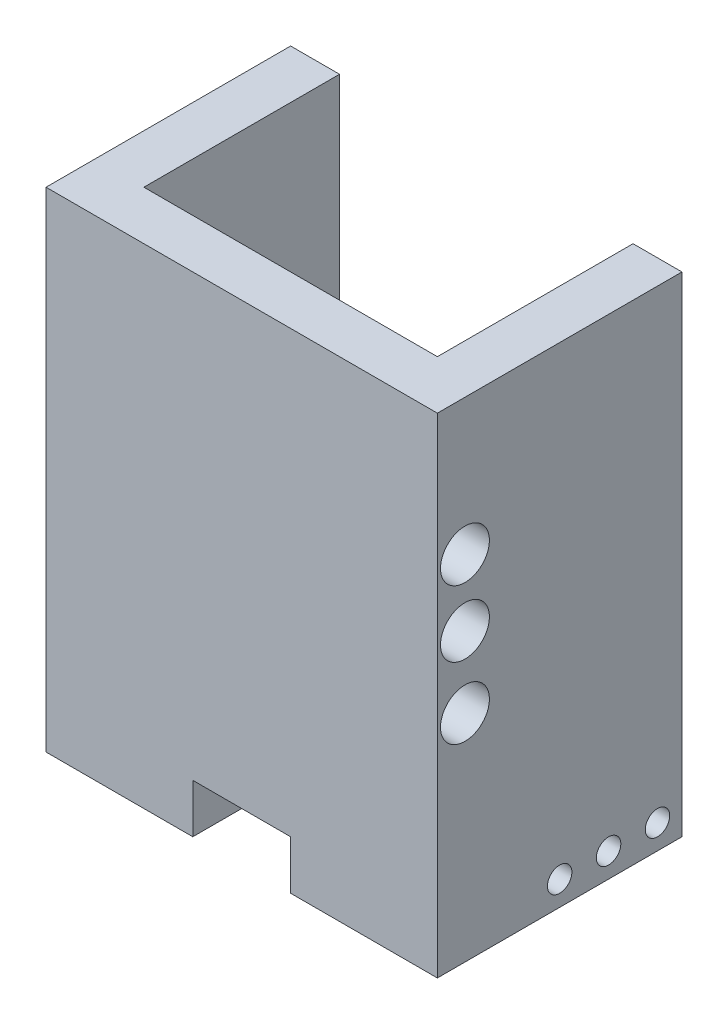
ISO-10303-21;
HEADER;
FILE_DESCRIPTION(('STEP AP214'),'2;1');
FILE_NAME('part.step','',(''),(''),'','','');
FILE_SCHEMA(('AUTOMOTIVE_DESIGN { 1 0 10303 214 1 1 1 1 }'));
ENDSEC;
DATA;
#1=APPLICATION_CONTEXT('core data for automotive mechanical design processes');
#2=APPLICATION_PROTOCOL_DEFINITION('international standard','automotive_design',2000,#1);
#3=PRODUCT_CONTEXT('',#1,'mechanical');
#4=PRODUCT('Part','Part','',(#3));
#5=PRODUCT_RELATED_PRODUCT_CATEGORY('part','',(#4));
#6=PRODUCT_DEFINITION_FORMATION('','',#4);
#7=PRODUCT_DEFINITION_CONTEXT('part definition',#1,'design');
#8=PRODUCT_DEFINITION('design','',#6,#7);
#9=PRODUCT_DEFINITION_SHAPE('','',#8);
#10=(LENGTH_UNIT() NAMED_UNIT(*) SI_UNIT(.MILLI.,.METRE.));
#11=(NAMED_UNIT(*) PLANE_ANGLE_UNIT() SI_UNIT($,.RADIAN.));
#12=(NAMED_UNIT(*) SI_UNIT($,.STERADIAN.) SOLID_ANGLE_UNIT());
#13=UNCERTAINTY_MEASURE_WITH_UNIT(LENGTH_MEASURE(1.E-05),#10,'distance_accuracy_value','');
#14=(GEOMETRIC_REPRESENTATION_CONTEXT(3) GLOBAL_UNCERTAINTY_ASSIGNED_CONTEXT((#13)) GLOBAL_UNIT_ASSIGNED_CONTEXT((#10,
#11,#12)) REPRESENTATION_CONTEXT('',''));
#15=CARTESIAN_POINT('',(0.,0.,0.));
#16=DIRECTION('',(0.,0.,1.));
#17=DIRECTION('',(1.,0.,0.));
#18=AXIS2_PLACEMENT_3D('',#15,#16,#17);
#19=CARTESIAN_POINT('',(-38.1,-127.,-12.7));
#20=DIRECTION('',(0.,0.,1.));
#21=DIRECTION('',(1.,0.,0.));
#22=AXIS2_PLACEMENT_3D('',#19,#20,#21);
#23=PLANE('',#22);
#24=DIRECTION('',(0.,1.,0.));
#25=VECTOR('',#24,1.);
#26=CARTESIAN_POINT('',(38.1,-127.,-12.7));
#27=LINE('',#26,#25);
#28=CARTESIAN_POINT('',(38.1,-67.9251795053301,-12.7));
#29=VERTEX_POINT('',#28);
#30=CARTESIAN_POINT('',(38.1,-55.6333245401822,-12.7));
#31=VERTEX_POINT('',#30);
#32=EDGE_CURVE('E163',#29,#31,#27,.T.);
#33=ORIENTED_EDGE('',*,*,#32,.F.);
#34=DIRECTION('',(-1.,0.,0.));
#35=VECTOR('',#34,1.);
#36=CARTESIAN_POINT('',(50.8,-67.9251795053301,-12.7));
#37=LINE('',#36,#35);
#38=CARTESIAN_POINT('',(-38.1,-67.9251795053301,-12.7));
#39=VERTEX_POINT('',#38);
#40=EDGE_CURVE('E158',#29,#39,#37,.T.);
#41=ORIENTED_EDGE('',*,*,#40,.T.);
#42=DIRECTION('',(0.,1.,0.));
#43=VECTOR('',#42,1.);
#44=CARTESIAN_POINT('',(-38.1,-127.,-12.7));
#45=LINE('',#44,#43);
#46=CARTESIAN_POINT('',(-38.1,-55.6333245401822,-12.7));
#47=VERTEX_POINT('',#46);
#48=EDGE_CURVE('E56',#39,#47,#45,.T.);
#49=ORIENTED_EDGE('',*,*,#48,.T.);
#50=DIRECTION('',(-1.,0.,0.));
#51=VECTOR('',#50,1.);
#52=CARTESIAN_POINT('',(50.8,-55.6333245401822,-12.7));
#53=LINE('',#52,#51);
#54=EDGE_CURVE('E289',#47,#31,#53,.F.);
#55=ORIENTED_EDGE('',*,*,#54,.T.);
#56=EDGE_LOOP('',(#33,#41,#49,#55));
#57=FACE_BOUND('',#56,.T.);
#58=ADVANCED_FACE('F32',(#57),#23,.F.);
#59=CARTESIAN_POINT('',(38.1,-49.4271387499624,-12.7));
#60=VERTEX_POINT('',#59);
#61=CARTESIAN_POINT('',(38.1,-38.4258447677471,-12.7));
#62=VERTEX_POINT('',#61);
#63=EDGE_CURVE('E337',#60,#62,#27,.T.);
#64=ORIENTED_EDGE('',*,*,#63,.F.);
#65=DIRECTION('',(-1.,0.,0.));
#66=VECTOR('',#65,1.);
#67=CARTESIAN_POINT('',(50.8,-49.4271387499624,-12.7));
#68=LINE('',#67,#66);
#69=CARTESIAN_POINT('',(-38.1,-49.4271387499624,-12.7));
#70=VERTEX_POINT('',#69);
#71=EDGE_CURVE('E293',#60,#70,#68,.T.);
#72=ORIENTED_EDGE('',*,*,#71,.T.);
#73=CARTESIAN_POINT('',(-38.1,-38.4258447677471,-12.7));
#74=VERTEX_POINT('',#73);
#75=EDGE_CURVE('E170',#70,#74,#45,.T.);
#76=ORIENTED_EDGE('',*,*,#75,.T.);
#77=DIRECTION('',(-1.,0.,0.));
#78=VECTOR('',#77,1.);
#79=CARTESIAN_POINT('',(50.8,-38.4258447677471,-12.7));
#80=LINE('',#79,#78);
#81=EDGE_CURVE('E303',#74,#62,#80,.F.);
#82=ORIENTED_EDGE('',*,*,#81,.T.);
#83=EDGE_LOOP('',(#64,#72,#76,#82));
#84=FACE_BOUND('',#83,.T.);
#85=ADVANCED_FACE('F347',(#84),#23,.F.);
#86=CARTESIAN_POINT('',(38.1,-32.2196589775273,-12.7));
#87=VERTEX_POINT('',#86);
#88=CARTESIAN_POINT('',(38.1,0.,-12.7));
#89=VERTEX_POINT('',#88);
#90=EDGE_CURVE('E172',#87,#89,#27,.T.);
#91=ORIENTED_EDGE('',*,*,#90,.F.);
#92=DIRECTION('',(-1.,0.,0.));
#93=VECTOR('',#92,1.);
#94=CARTESIAN_POINT('',(50.8,-32.2196589775273,-12.7));
#95=LINE('',#94,#93);
#96=CARTESIAN_POINT('',(-38.1,-32.2196589775273,-12.7));
#97=VERTEX_POINT('',#96);
#98=EDGE_CURVE('E308',#87,#97,#95,.T.);
#99=ORIENTED_EDGE('',*,*,#98,.T.);
#100=CARTESIAN_POINT('',(-38.1,0.,-12.7));
#101=VERTEX_POINT('',#100);
#102=EDGE_CURVE('E173',#97,#101,#45,.T.);
#103=ORIENTED_EDGE('',*,*,#102,.T.);
#104=DIRECTION('',(1.,0.,0.));
#105=VECTOR('',#104,1.);
#106=CARTESIAN_POINT('',(-38.1,0.,-12.7));
#107=LINE('',#106,#105);
#108=EDGE_CURVE('E327',#101,#89,#107,.T.);
#109=ORIENTED_EDGE('',*,*,#108,.T.);
#110=EDGE_LOOP('',(#91,#99,#103,#109));
#111=FACE_BOUND('',#110,.T.);
#112=ADVANCED_FACE('F350',(#111),#23,.F.);
#113=CARTESIAN_POINT('',(0.,0.,-63.5));
#114=DIRECTION('',(0.,0.,-1.));
#115=DIRECTION('',(-1.,0.,0.));
#116=AXIS2_PLACEMENT_3D('',#113,#114,#115);
#117=PLANE('',#116);
#118=DIRECTION('',(0.,1.,0.));
#119=VECTOR('',#118,1.);
#120=CARTESIAN_POINT('',(38.1,-127.,-63.5));
#121=LINE('',#120,#119);
#122=CARTESIAN_POINT('',(38.1,-127.,-63.5));
#123=VERTEX_POINT('',#122);
#124=CARTESIAN_POINT('',(38.1,0.,-63.5));
#125=VERTEX_POINT('',#124);
#126=EDGE_CURVE('E184',#123,#125,#121,.T.);
#127=ORIENTED_EDGE('',*,*,#126,.T.);
#128=DIRECTION('',(-1.,0.,0.));
#129=VECTOR('',#128,1.);
#130=CARTESIAN_POINT('',(-50.8,0.,-63.5));
#131=LINE('',#130,#129);
#132=CARTESIAN_POINT('',(50.8,0.,-63.5));
#133=VERTEX_POINT('',#132);
#134=EDGE_CURVE('E202',#133,#125,#131,.T.);
#135=ORIENTED_EDGE('',*,*,#134,.F.);
#136=DIRECTION('',(0.,1.,0.));
#137=VECTOR('',#136,1.);
#138=CARTESIAN_POINT('',(50.8,-127.,-63.5));
#139=LINE('',#138,#137);
#140=CARTESIAN_POINT('',(50.8,-127.,-63.5));
#141=VERTEX_POINT('',#140);
#142=EDGE_CURVE('E198',#141,#133,#139,.T.);
#143=ORIENTED_EDGE('',*,*,#142,.F.);
#144=DIRECTION('',(1.,0.,0.));
#145=VECTOR('',#144,1.);
#146=CARTESIAN_POINT('',(12.7,-127.,-63.5));
#147=LINE('',#146,#145);
#148=EDGE_CURVE('E196',#123,#141,#147,.T.);
#149=ORIENTED_EDGE('',*,*,#148,.F.);
#150=EDGE_LOOP('',(#127,#135,#143,#149));
#151=FACE_BOUND('',#150,.T.);
#152=ADVANCED_FACE('F362',(#151),#117,.T.);
#153=CARTESIAN_POINT('',(-50.8,-127.,-63.5));
#154=DIRECTION('',(-1.,0.,0.));
#155=DIRECTION('',(0.,0.,1.));
#156=AXIS2_PLACEMENT_3D('',#153,#154,#155);
#157=PLANE('',#156);
#158=CARTESIAN_POINT('',(-50.8,-120.65,-31.75));
#159=DIRECTION('',(-1.,0.,0.));
#160=DIRECTION('',(0.,0.,1.));
#161=AXIS2_PLACEMENT_3D('',#158,#159,#160);
#162=CIRCLE('',#161,3.175);
#163=CARTESIAN_POINT('',(-50.8,-120.65,-28.575));
#164=VERTEX_POINT('',#163);
#165=EDGE_CURVE('E623',#164,#164,#162,.T.);
#166=ORIENTED_EDGE('',*,*,#165,.F.);
#167=EDGE_LOOP('',(#166));
#168=FACE_BOUND('',#167,.T.);
#169=CARTESIAN_POINT('',(-50.8,-120.65,-44.45));
#170=DIRECTION('',(-1.,0.,0.));
#171=DIRECTION('',(0.,0.,1.));
#172=AXIS2_PLACEMENT_3D('',#169,#170,#171);
#173=CIRCLE('',#172,3.175);
#174=CARTESIAN_POINT('',(-50.8,-120.65,-41.275));
#175=VERTEX_POINT('',#174);
#176=EDGE_CURVE('E261',#175,#175,#173,.T.);
#177=ORIENTED_EDGE('',*,*,#176,.F.);
#178=EDGE_LOOP('',(#177));
#179=FACE_BOUND('',#178,.T.);
#180=CARTESIAN_POINT('',(-50.8,-120.65,-57.15));
#181=DIRECTION('',(-1.,0.,0.));
#182=DIRECTION('',(0.,0.,1.));
#183=AXIS2_PLACEMENT_3D('',#180,#181,#182);
#184=CIRCLE('',#183,3.175);
#185=CARTESIAN_POINT('',(-50.8,-120.65,-53.975));
#186=VERTEX_POINT('',#185);
#187=EDGE_CURVE('E258',#186,#186,#184,.T.);
#188=ORIENTED_EDGE('',*,*,#187,.F.);
#189=EDGE_LOOP('',(#188));
#190=FACE_BOUND('',#189,.T.);
#191=CARTESIAN_POINT('',(-50.8,-71.02827240044,-7.15984526530906));
#192=DIRECTION('',(-1.,0.,0.));
#193=DIRECTION('',(0.,0.,1.));
#194=AXIS2_PLACEMENT_3D('',#191,#192,#193);
#195=CIRCLE('',#194,6.35);
#196=CARTESIAN_POINT('',(-50.8,-71.02827240044,-0.809845265309065));
#197=VERTEX_POINT('',#196);
#198=EDGE_CURVE('E277',#197,#197,#195,.T.);
#199=ORIENTED_EDGE('',*,*,#198,.F.);
#200=EDGE_LOOP('',(#199));
#201=FACE_BOUND('',#200,.T.);
#202=CARTESIAN_POINT('',(-50.8,-52.5302316450723,-7.15984526530906));
#203=DIRECTION('',(-1.,0.,0.));
#204=DIRECTION('',(0.,0.,1.));
#205=AXIS2_PLACEMENT_3D('',#202,#203,#204);
#206=CIRCLE('',#205,6.35);
#207=CARTESIAN_POINT('',(-50.8,-52.5302316450723,-0.809845265309062));
#208=VERTEX_POINT('',#207);
#209=EDGE_CURVE('E285',#208,#208,#206,.T.);
#210=ORIENTED_EDGE('',*,*,#209,.F.);
#211=EDGE_LOOP('',(#210));
#212=FACE_BOUND('',#211,.T.);
#213=CARTESIAN_POINT('',(-50.8,-35.3227518726372,-7.15984526530906));
#214=DIRECTION('',(-1.,0.,0.));
#215=DIRECTION('',(0.,0.,1.));
#216=AXIS2_PLACEMENT_3D('',#213,#214,#215);
#217=CIRCLE('',#216,6.35);
#218=CARTESIAN_POINT('',(-50.8,-35.3227518726372,-0.809845265309062));
#219=VERTEX_POINT('',#218);
#220=EDGE_CURVE('E299',#219,#219,#217,.T.);
#221=ORIENTED_EDGE('',*,*,#220,.F.);
#222=EDGE_LOOP('',(#221));
#223=FACE_BOUND('',#222,.T.);
#224=DIRECTION('',(0.,-1.,0.));
#225=VECTOR('',#224,1.);
#226=CARTESIAN_POINT('',(-50.8,-127.,0.));
#227=LINE('',#226,#225);
#228=CARTESIAN_POINT('',(-50.8,0.,0.));
#229=VERTEX_POINT('',#228);
#230=CARTESIAN_POINT('',(-50.8,-127.,0.));
#231=VERTEX_POINT('',#230);
#232=EDGE_CURVE('E188',#229,#231,#227,.T.);
#233=ORIENTED_EDGE('',*,*,#232,.F.);
#234=DIRECTION('',(0.,0.,1.));
#235=VECTOR('',#234,1.);
#236=CARTESIAN_POINT('',(-50.8,0.,-63.5));
#237=LINE('',#236,#235);
#238=CARTESIAN_POINT('',(-50.8,0.,-63.5));
#239=VERTEX_POINT('',#238);
#240=EDGE_CURVE('E228',#239,#229,#237,.T.);
#241=ORIENTED_EDGE('',*,*,#240,.F.);
#242=DIRECTION('',(0.,-1.,0.));
#243=VECTOR('',#242,1.);
#244=CARTESIAN_POINT('',(-50.8,-127.,-63.5));
#245=LINE('',#244,#243);
#246=CARTESIAN_POINT('',(-50.8,-127.,-63.5));
#247=VERTEX_POINT('',#246);
#248=EDGE_CURVE('E189',#239,#247,#245,.T.);
#249=ORIENTED_EDGE('',*,*,#248,.T.);
#250=DIRECTION('',(0.,0.,1.));
#251=VECTOR('',#250,1.);
#252=CARTESIAN_POINT('',(-50.8,-127.,-63.5));
#253=LINE('',#252,#251);
#254=EDGE_CURVE('E205',#247,#231,#253,.T.);
#255=ORIENTED_EDGE('',*,*,#254,.T.);
#256=EDGE_LOOP('',(#233,#241,#249,#255));
#257=FACE_BOUND('',#256,.T.);
#258=ADVANCED_FACE('F34',(#168,#179,#190,#201,#212,#223,#257),#157,.T.);
#259=CARTESIAN_POINT('',(-50.8,0.,-63.5));
#260=DIRECTION('',(0.,1.,0.));
#261=DIRECTION('',(0.,0.,1.));
#262=AXIS2_PLACEMENT_3D('',#259,#260,#261);
#263=PLANE('',#262);
#264=DIRECTION('',(0.,0.,-1.));
#265=VECTOR('',#264,1.);
#266=CARTESIAN_POINT('',(38.1,0.,-63.5));
#267=LINE('',#266,#265);
#268=EDGE_CURVE('E319',#89,#125,#267,.T.);
#269=ORIENTED_EDGE('',*,*,#268,.F.);
#270=ORIENTED_EDGE('',*,*,#108,.F.);
#271=DIRECTION('',(0.,0.,1.));
#272=VECTOR('',#271,1.);
#273=CARTESIAN_POINT('',(-38.1,0.,-50.8));
#274=LINE('',#273,#272);
#275=CARTESIAN_POINT('',(-38.1,0.,-63.5));
#276=VERTEX_POINT('',#275);
#277=EDGE_CURVE('E314',#276,#101,#274,.T.);
#278=ORIENTED_EDGE('',*,*,#277,.F.);
#279=EDGE_CURVE('E201',#276,#239,#131,.T.);
#280=ORIENTED_EDGE('',*,*,#279,.T.);
#281=ORIENTED_EDGE('',*,*,#240,.T.);
#282=DIRECTION('',(-1.,0.,0.));
#283=VECTOR('',#282,1.);
#284=CARTESIAN_POINT('',(-50.8,0.,0.));
#285=LINE('',#284,#283);
#286=CARTESIAN_POINT('',(50.8,0.,0.));
#287=VERTEX_POINT('',#286);
#288=EDGE_CURVE('E193',#287,#229,#285,.T.);
#289=ORIENTED_EDGE('',*,*,#288,.F.);
#290=DIRECTION('',(0.,0.,1.));
#291=VECTOR('',#290,1.);
#292=CARTESIAN_POINT('',(50.8,0.,-63.5));
#293=LINE('',#292,#291);
#294=EDGE_CURVE('E231',#133,#287,#293,.T.);
#295=ORIENTED_EDGE('',*,*,#294,.F.);
#296=ORIENTED_EDGE('',*,*,#134,.T.);
#297=EDGE_LOOP('',(#269,#270,#278,#280,#281,#289,#295,#296));
#298=FACE_BOUND('',#297,.T.);
#299=ADVANCED_FACE('F355',(#298),#263,.T.);
#300=CARTESIAN_POINT('',(50.8,-127.,-63.5));
#301=DIRECTION('',(1.,0.,0.));
#302=DIRECTION('',(0.,0.,-1.));
#303=AXIS2_PLACEMENT_3D('',#300,#301,#302);
#304=PLANE('',#303);
#305=CARTESIAN_POINT('',(50.8,-120.65,-31.75));
#306=DIRECTION('',(-1.,0.,0.));
#307=DIRECTION('',(0.,0.,1.));
#308=AXIS2_PLACEMENT_3D('',#305,#306,#307);
#309=CIRCLE('',#308,3.175);
#310=CARTESIAN_POINT('',(50.8,-120.65,-28.575));
#311=VERTEX_POINT('',#310);
#312=EDGE_CURVE('E606',#311,#311,#309,.T.);
#313=ORIENTED_EDGE('',*,*,#312,.T.);
#314=EDGE_LOOP('',(#313));
#315=FACE_BOUND('',#314,.T.);
#316=CARTESIAN_POINT('',(50.8,-120.65,-44.45));
#317=DIRECTION('',(-1.,0.,0.));
#318=DIRECTION('',(0.,0.,1.));
#319=AXIS2_PLACEMENT_3D('',#316,#317,#318);
#320=CIRCLE('',#319,3.175);
#321=CARTESIAN_POINT('',(50.8,-120.65,-41.275));
#322=VERTEX_POINT('',#321);
#323=EDGE_CURVE('E254',#322,#322,#320,.T.);
#324=ORIENTED_EDGE('',*,*,#323,.T.);
#325=EDGE_LOOP('',(#324));
#326=FACE_BOUND('',#325,.T.);
#327=CARTESIAN_POINT('',(50.8,-120.65,-57.15));
#328=DIRECTION('',(-1.,0.,0.));
#329=DIRECTION('',(0.,0.,1.));
#330=AXIS2_PLACEMENT_3D('',#327,#328,#329);
#331=CIRCLE('',#330,3.175);
#332=CARTESIAN_POINT('',(50.8,-120.65,-53.975));
#333=VERTEX_POINT('',#332);
#334=EDGE_CURVE('E250',#333,#333,#331,.T.);
#335=ORIENTED_EDGE('',*,*,#334,.T.);
#336=EDGE_LOOP('',(#335));
#337=FACE_BOUND('',#336,.T.);
#338=CARTESIAN_POINT('',(50.8,-71.02827240044,-7.15984526530906));
#339=DIRECTION('',(-1.,0.,0.));
#340=DIRECTION('',(0.,0.,1.));
#341=AXIS2_PLACEMENT_3D('',#338,#339,#340);
#342=CIRCLE('',#341,6.35);
#343=CARTESIAN_POINT('',(50.8,-71.02827240044,-0.809845265309065));
#344=VERTEX_POINT('',#343);
#345=EDGE_CURVE('E278',#344,#344,#342,.T.);
#346=ORIENTED_EDGE('',*,*,#345,.T.);
#347=EDGE_LOOP('',(#346));
#348=FACE_BOUND('',#347,.T.);
#349=CARTESIAN_POINT('',(50.8,-52.5302316450723,-7.15984526530906));
#350=DIRECTION('',(-1.,0.,0.));
#351=DIRECTION('',(0.,0.,1.));
#352=AXIS2_PLACEMENT_3D('',#349,#350,#351);
#353=CIRCLE('',#352,6.35);
#354=CARTESIAN_POINT('',(50.8,-52.5302316450723,-0.809845265309062));
#355=VERTEX_POINT('',#354);
#356=EDGE_CURVE('E286',#355,#355,#353,.T.);
#357=ORIENTED_EDGE('',*,*,#356,.T.);
#358=EDGE_LOOP('',(#357));
#359=FACE_BOUND('',#358,.T.);
#360=CARTESIAN_POINT('',(50.8,-35.3227518726372,-7.15984526530906));
#361=DIRECTION('',(-1.,0.,0.));
#362=DIRECTION('',(0.,0.,1.));
#363=AXIS2_PLACEMENT_3D('',#360,#361,#362);
#364=CIRCLE('',#363,6.35);
#365=CARTESIAN_POINT('',(50.8,-35.3227518726372,-0.809845265309062));
#366=VERTEX_POINT('',#365);
#367=EDGE_CURVE('E300',#366,#366,#364,.T.);
#368=ORIENTED_EDGE('',*,*,#367,.T.);
#369=EDGE_LOOP('',(#368));
#370=FACE_BOUND('',#369,.T.);
#371=DIRECTION('',(0.,1.,0.));
#372=VECTOR('',#371,1.);
#373=CARTESIAN_POINT('',(50.8,-127.,0.));
#374=LINE('',#373,#372);
#375=CARTESIAN_POINT('',(50.8,-127.,0.));
#376=VERTEX_POINT('',#375);
#377=EDGE_CURVE('E223',#376,#287,#374,.T.);
#378=ORIENTED_EDGE('',*,*,#377,.F.);
#379=DIRECTION('',(0.,0.,1.));
#380=VECTOR('',#379,1.);
#381=CARTESIAN_POINT('',(50.8,-127.,-63.5));
#382=LINE('',#381,#380);
#383=EDGE_CURVE('E233',#141,#376,#382,.T.);
#384=ORIENTED_EDGE('',*,*,#383,.F.);
#385=ORIENTED_EDGE('',*,*,#142,.T.);
#386=ORIENTED_EDGE('',*,*,#294,.T.);
#387=EDGE_LOOP('',(#378,#384,#385,#386));
#388=FACE_BOUND('',#387,.T.);
#389=ADVANCED_FACE('F365',(#315,#326,#337,#348,#359,#370,#388),#304,.T.);
#390=CARTESIAN_POINT('',(12.7,-127.,-63.5));
#391=DIRECTION('',(0.,-1.,0.));
#392=DIRECTION('',(0.,0.,-1.));
#393=AXIS2_PLACEMENT_3D('',#390,#391,#392);
#394=PLANE('',#393);
#395=DIRECTION('',(0.,0.,-1.));
#396=VECTOR('',#395,1.);
#397=CARTESIAN_POINT('',(38.1,-127.,-12.7));
#398=LINE('',#397,#396);
#399=CARTESIAN_POINT('',(38.1,-127.,-12.7));
#400=VERTEX_POINT('',#399);
#401=EDGE_CURVE('E180',#400,#123,#398,.T.);
#402=ORIENTED_EDGE('',*,*,#401,.T.);
#403=ORIENTED_EDGE('',*,*,#148,.T.);
#404=ORIENTED_EDGE('',*,*,#383,.T.);
#405=DIRECTION('',(1.,0.,0.));
#406=VECTOR('',#405,1.);
#407=CARTESIAN_POINT('',(12.7,-127.,0.));
#408=LINE('',#407,#406);
#409=CARTESIAN_POINT('',(12.7,-127.,0.));
#410=VERTEX_POINT('',#409);
#411=EDGE_CURVE('E220',#410,#376,#408,.T.);
#412=ORIENTED_EDGE('',*,*,#411,.F.);
#413=DIRECTION('',(0.,0.,1.));
#414=VECTOR('',#413,1.);
#415=CARTESIAN_POINT('',(12.7,-127.,-63.5));
#416=LINE('',#415,#414);
#417=CARTESIAN_POINT('',(12.7,-127.,-12.7));
#418=VERTEX_POINT('',#417);
#419=EDGE_CURVE('E235',#418,#410,#416,.T.);
#420=ORIENTED_EDGE('',*,*,#419,.F.);
#421=DIRECTION('',(1.,0.,0.));
#422=VECTOR('',#421,1.);
#423=CARTESIAN_POINT('',(-38.1,-127.,-12.7));
#424=LINE('',#423,#422);
#425=EDGE_CURVE('E318',#418,#400,#424,.T.);
#426=ORIENTED_EDGE('',*,*,#425,.T.);
#427=EDGE_LOOP('',(#402,#403,#404,#412,#420,#426));
#428=FACE_BOUND('',#427,.T.);
#429=ADVANCED_FACE('F358',(#428),#394,.T.);
#430=CARTESIAN_POINT('',(12.7,-127.,-63.5));
#431=DIRECTION('',(-1.,0.,0.));
#432=DIRECTION('',(0.,0.,1.));
#433=AXIS2_PLACEMENT_3D('',#430,#431,#432);
#434=PLANE('',#433);
#435=DIRECTION('',(0.,1.,0.));
#436=VECTOR('',#435,1.);
#437=CARTESIAN_POINT('',(12.7,-127.,-12.7));
#438=LINE('',#437,#436);
#439=CARTESIAN_POINT('',(12.7,-114.3,-12.7));
#440=VERTEX_POINT('',#439);
#441=EDGE_CURVE('E186',#418,#440,#438,.T.);
#442=ORIENTED_EDGE('',*,*,#441,.F.);
#443=ORIENTED_EDGE('',*,*,#419,.T.);
#444=DIRECTION('',(0.,-1.,0.));
#445=VECTOR('',#444,1.);
#446=CARTESIAN_POINT('',(12.7,-127.,0.));
#447=LINE('',#446,#445);
#448=CARTESIAN_POINT('',(12.7,-114.3,0.));
#449=VERTEX_POINT('',#448);
#450=EDGE_CURVE('E217',#449,#410,#447,.T.);
#451=ORIENTED_EDGE('',*,*,#450,.F.);
#452=DIRECTION('',(0.,0.,1.));
#453=VECTOR('',#452,1.);
#454=CARTESIAN_POINT('',(12.7,-114.3,-63.5));
#455=LINE('',#454,#453);
#456=EDGE_CURVE('E237',#440,#449,#455,.T.);
#457=ORIENTED_EDGE('',*,*,#456,.F.);
#458=EDGE_LOOP('',(#442,#443,#451,#457));
#459=FACE_BOUND('',#458,.T.);
#460=ADVANCED_FACE('F374',(#459),#434,.T.);
#461=CARTESIAN_POINT('',(-12.7,-114.3,-63.5));
#462=DIRECTION('',(0.,-1.,0.));
#463=DIRECTION('',(0.,0.,-1.));
#464=AXIS2_PLACEMENT_3D('',#461,#462,#463);
#465=PLANE('',#464);
#466=DIRECTION('',(-1.,0.,0.));
#467=VECTOR('',#466,1.);
#468=CARTESIAN_POINT('',(-12.7,-114.3,-12.7));
#469=LINE('',#468,#467);
#470=CARTESIAN_POINT('',(-12.7,-114.3,-12.7));
#471=VERTEX_POINT('',#470);
#472=EDGE_CURVE('E183',#440,#471,#469,.T.);
#473=ORIENTED_EDGE('',*,*,#472,.F.);
#474=ORIENTED_EDGE('',*,*,#456,.T.);
#475=DIRECTION('',(1.,0.,0.));
#476=VECTOR('',#475,1.);
#477=CARTESIAN_POINT('',(-12.7,-114.3,0.));
#478=LINE('',#477,#476);
#479=CARTESIAN_POINT('',(-12.7,-114.3,0.));
#480=VERTEX_POINT('',#479);
#481=EDGE_CURVE('E214',#480,#449,#478,.T.);
#482=ORIENTED_EDGE('',*,*,#481,.F.);
#483=DIRECTION('',(0.,0.,1.));
#484=VECTOR('',#483,1.);
#485=CARTESIAN_POINT('',(-12.7,-114.3,-63.5));
#486=LINE('',#485,#484);
#487=EDGE_CURVE('E239',#471,#480,#486,.T.);
#488=ORIENTED_EDGE('',*,*,#487,.F.);
#489=EDGE_LOOP('',(#473,#474,#482,#488));
#490=FACE_BOUND('',#489,.T.);
#491=ADVANCED_FACE('F381',(#490),#465,.T.);
#492=CARTESIAN_POINT('',(-12.7,-127.,-63.5));
#493=DIRECTION('',(1.,0.,0.));
#494=DIRECTION('',(0.,0.,-1.));
#495=AXIS2_PLACEMENT_3D('',#492,#493,#494);
#496=PLANE('',#495);
#497=DIRECTION('',(0.,-1.,0.));
#498=VECTOR('',#497,1.);
#499=CARTESIAN_POINT('',(-12.7,-127.,-12.7));
#500=LINE('',#499,#498);
#501=CARTESIAN_POINT('',(-12.7,-127.,-12.7));
#502=VERTEX_POINT('',#501);
#503=EDGE_CURVE('E181',#471,#502,#500,.T.);
#504=ORIENTED_EDGE('',*,*,#503,.F.);
#505=ORIENTED_EDGE('',*,*,#487,.T.);
#506=DIRECTION('',(0.,1.,0.));
#507=VECTOR('',#506,1.);
#508=CARTESIAN_POINT('',(-12.7,-127.,0.));
#509=LINE('',#508,#507);
#510=CARTESIAN_POINT('',(-12.7,-127.,0.));
#511=VERTEX_POINT('',#510);
#512=EDGE_CURVE('E211',#511,#480,#509,.T.);
#513=ORIENTED_EDGE('',*,*,#512,.F.);
#514=DIRECTION('',(0.,0.,1.));
#515=VECTOR('',#514,1.);
#516=CARTESIAN_POINT('',(-12.7,-127.,-63.5));
#517=LINE('',#516,#515);
#518=EDGE_CURVE('E241',#502,#511,#517,.T.);
#519=ORIENTED_EDGE('',*,*,#518,.F.);
#520=EDGE_LOOP('',(#504,#505,#513,#519));
#521=FACE_BOUND('',#520,.T.);
#522=ADVANCED_FACE('F384',(#521),#496,.T.);
#523=CARTESIAN_POINT('',(-50.8,-127.,-63.5));
#524=DIRECTION('',(0.,-1.,0.));
#525=DIRECTION('',(0.,0.,-1.));
#526=AXIS2_PLACEMENT_3D('',#523,#524,#525);
#527=PLANE('',#526);
#528=CARTESIAN_POINT('',(-38.1,-127.,-12.7));
#529=VERTEX_POINT('',#528);
#530=EDGE_CURVE('E320',#529,#502,#424,.T.);
#531=ORIENTED_EDGE('',*,*,#530,.T.);
#532=ORIENTED_EDGE('',*,*,#518,.T.);
#533=DIRECTION('',(1.,0.,0.));
#534=VECTOR('',#533,1.);
#535=CARTESIAN_POINT('',(-50.8,-127.,0.));
#536=LINE('',#535,#534);
#537=EDGE_CURVE('E208',#231,#511,#536,.T.);
#538=ORIENTED_EDGE('',*,*,#537,.F.);
#539=ORIENTED_EDGE('',*,*,#254,.F.);
#540=DIRECTION('',(1.,0.,0.));
#541=VECTOR('',#540,1.);
#542=CARTESIAN_POINT('',(-50.8,-127.,-63.5));
#543=LINE('',#542,#541);
#544=CARTESIAN_POINT('',(-38.1,-127.,-63.5));
#545=VERTEX_POINT('',#544);
#546=EDGE_CURVE('E192',#247,#545,#543,.T.);
#547=ORIENTED_EDGE('',*,*,#546,.T.);
#548=DIRECTION('',(0.,0.,1.));
#549=VECTOR('',#548,1.);
#550=CARTESIAN_POINT('',(-38.1,-127.,-50.8));
#551=LINE('',#550,#549);
#552=EDGE_CURVE('E315',#545,#529,#551,.T.);
#553=ORIENTED_EDGE('',*,*,#552,.T.);
#554=EDGE_LOOP('',(#531,#532,#538,#539,#547,#553));
#555=FACE_BOUND('',#554,.T.);
#556=ADVANCED_FACE('F388',(#555),#527,.T.);
#557=DIRECTION('',(0.,1.,0.));
#558=VECTOR('',#557,1.);
#559=CARTESIAN_POINT('',(-38.1,-127.,-63.5));
#560=LINE('',#559,#558);
#561=EDGE_CURVE('E178',#545,#276,#560,.T.);
#562=ORIENTED_EDGE('',*,*,#561,.F.);
#563=ORIENTED_EDGE('',*,*,#546,.F.);
#564=ORIENTED_EDGE('',*,*,#248,.F.);
#565=ORIENTED_EDGE('',*,*,#279,.F.);
#566=EDGE_LOOP('',(#562,#563,#564,#565));
#567=FACE_BOUND('',#566,.T.);
#568=ADVANCED_FACE('F394',(#567),#117,.T.);
#569=CARTESIAN_POINT('',(0.,0.,0.));
#570=DIRECTION('',(0.,0.,-1.));
#571=DIRECTION('',(-1.,0.,0.));
#572=AXIS2_PLACEMENT_3D('',#569,#570,#571);
#573=PLANE('',#572);
#574=ORIENTED_EDGE('',*,*,#232,.T.);
#575=ORIENTED_EDGE('',*,*,#537,.T.);
#576=ORIENTED_EDGE('',*,*,#512,.T.);
#577=ORIENTED_EDGE('',*,*,#481,.T.);
#578=ORIENTED_EDGE('',*,*,#450,.T.);
#579=ORIENTED_EDGE('',*,*,#411,.T.);
#580=ORIENTED_EDGE('',*,*,#377,.T.);
#581=ORIENTED_EDGE('',*,*,#288,.T.);
#582=EDGE_LOOP('',(#574,#575,#576,#577,#578,#579,#580,#581));
#583=FACE_BOUND('',#582,.T.);
#584=ADVANCED_FACE('F369',(#583),#573,.F.);
#585=CARTESIAN_POINT('',(38.1,-127.,-63.5));
#586=DIRECTION('',(1.,0.,0.));
#587=DIRECTION('',(0.,0.,-1.));
#588=AXIS2_PLACEMENT_3D('',#585,#586,#587);
#589=PLANE('',#588);
#590=CARTESIAN_POINT('',(38.1,-120.65,-31.75));
#591=DIRECTION('',(1.,0.,0.));
#592=DIRECTION('',(0.,0.,-1.));
#593=AXIS2_PLACEMENT_3D('',#590,#591,#592);
#594=CIRCLE('',#593,3.175);
#595=CARTESIAN_POINT('',(38.1,-120.65,-34.925));
#596=VERTEX_POINT('',#595);
#597=EDGE_CURVE('E266',#596,#596,#594,.T.);
#598=ORIENTED_EDGE('',*,*,#597,.T.);
#599=EDGE_LOOP('',(#598));
#600=FACE_BOUND('',#599,.T.);
#601=CARTESIAN_POINT('',(38.1,-120.65,-44.45));
#602=DIRECTION('',(1.,0.,0.));
#603=DIRECTION('',(0.,0.,-1.));
#604=AXIS2_PLACEMENT_3D('',#601,#602,#603);
#605=CIRCLE('',#604,3.175);
#606=CARTESIAN_POINT('',(38.1,-120.65,-47.625));
#607=VERTEX_POINT('',#606);
#608=EDGE_CURVE('E253',#607,#607,#605,.T.);
#609=ORIENTED_EDGE('',*,*,#608,.T.);
#610=EDGE_LOOP('',(#609));
#611=FACE_BOUND('',#610,.T.);
#612=CARTESIAN_POINT('',(38.1,-120.65,-57.15));
#613=DIRECTION('',(1.,0.,0.));
#614=DIRECTION('',(0.,0.,-1.));
#615=AXIS2_PLACEMENT_3D('',#612,#613,#614);
#616=CIRCLE('',#615,3.175);
#617=CARTESIAN_POINT('',(38.1,-120.65,-60.325));
#618=VERTEX_POINT('',#617);
#619=EDGE_CURVE('E249',#618,#618,#616,.T.);
#620=ORIENTED_EDGE('',*,*,#619,.T.);
#621=EDGE_LOOP('',(#620));
#622=FACE_BOUND('',#621,.T.);
#623=CARTESIAN_POINT('',(38.1,-74.1313652955499,-12.7));
#624=VERTEX_POINT('',#623);
#625=EDGE_CURVE('E176',#400,#624,#27,.T.);
#626=ORIENTED_EDGE('',*,*,#625,.T.);
#627=CARTESIAN_POINT('',(38.1,-71.02827240044,-7.15984526530906));
#628=DIRECTION('',(1.,0.,0.));
#629=DIRECTION('',(0.,0.,-1.));
#630=AXIS2_PLACEMENT_3D('',#627,#628,#629);
#631=CIRCLE('',#630,6.35);
#632=EDGE_CURVE('E164',#624,#29,#631,.T.);
#633=ORIENTED_EDGE('',*,*,#632,.T.);
#634=ORIENTED_EDGE('',*,*,#32,.T.);
#635=CARTESIAN_POINT('',(38.1,-52.5302316450723,-7.15984526530906));
#636=DIRECTION('',(1.,0.,0.));
#637=DIRECTION('',(0.,0.,-1.));
#638=AXIS2_PLACEMENT_3D('',#635,#636,#637);
#639=CIRCLE('',#638,6.35);
#640=EDGE_CURVE('E296',#31,#60,#639,.T.);
#641=ORIENTED_EDGE('',*,*,#640,.T.);
#642=ORIENTED_EDGE('',*,*,#63,.T.);
#643=CARTESIAN_POINT('',(38.1,-35.3227518726372,-7.15984526530906));
#644=DIRECTION('',(1.,0.,0.));
#645=DIRECTION('',(0.,0.,-1.));
#646=AXIS2_PLACEMENT_3D('',#643,#644,#645);
#647=CIRCLE('',#646,6.35);
#648=EDGE_CURVE('E311',#62,#87,#647,.T.);
#649=ORIENTED_EDGE('',*,*,#648,.T.);
#650=ORIENTED_EDGE('',*,*,#90,.T.);
#651=ORIENTED_EDGE('',*,*,#268,.T.);
#652=ORIENTED_EDGE('',*,*,#126,.F.);
#653=ORIENTED_EDGE('',*,*,#401,.F.);
#654=EDGE_LOOP('',(#626,#633,#634,#641,#642,#649,#650,#651,#652,#653));
#655=FACE_BOUND('',#654,.T.);
#656=ADVANCED_FACE('F341',(#600,#611,#622,#655),#589,.F.);
#657=CARTESIAN_POINT('',(-38.1,-74.1313652955499,-12.7));
#658=VERTEX_POINT('',#657);
#659=EDGE_CURVE('E169',#529,#658,#45,.T.);
#660=ORIENTED_EDGE('',*,*,#659,.T.);
#661=DIRECTION('',(-1.,0.,0.));
#662=VECTOR('',#661,1.);
#663=CARTESIAN_POINT('',(50.8,-74.1313652955499,-12.7));
#664=LINE('',#663,#662);
#665=EDGE_CURVE('E49',#658,#624,#664,.F.);
#666=ORIENTED_EDGE('',*,*,#665,.T.);
#667=ORIENTED_EDGE('',*,*,#625,.F.);
#668=ORIENTED_EDGE('',*,*,#425,.F.);
#669=ORIENTED_EDGE('',*,*,#441,.T.);
#670=ORIENTED_EDGE('',*,*,#472,.T.);
#671=ORIENTED_EDGE('',*,*,#503,.T.);
#672=ORIENTED_EDGE('',*,*,#530,.F.);
#673=EDGE_LOOP('',(#660,#666,#667,#668,#669,#670,#671,#672));
#674=FACE_BOUND('',#673,.T.);
#675=ADVANCED_FACE('F377',(#674),#23,.F.);
#676=CARTESIAN_POINT('',(-38.1,-127.,-50.8));
#677=DIRECTION('',(-1.,0.,0.));
#678=DIRECTION('',(0.,0.,1.));
#679=AXIS2_PLACEMENT_3D('',#676,#677,#678);
#680=PLANE('',#679);
#681=CARTESIAN_POINT('',(-38.1,-120.65,-31.75));
#682=DIRECTION('',(-1.,0.,0.));
#683=DIRECTION('',(0.,0.,1.));
#684=AXIS2_PLACEMENT_3D('',#681,#682,#683);
#685=CIRCLE('',#684,3.175);
#686=CARTESIAN_POINT('',(-38.1,-120.65,-28.575));
#687=VERTEX_POINT('',#686);
#688=EDGE_CURVE('E36',#687,#687,#685,.T.);
#689=ORIENTED_EDGE('',*,*,#688,.T.);
#690=EDGE_LOOP('',(#689));
#691=FACE_BOUND('',#690,.T.);
#692=CARTESIAN_POINT('',(-38.1,-120.65,-44.45));
#693=DIRECTION('',(-1.,0.,0.));
#694=DIRECTION('',(0.,0.,1.));
#695=AXIS2_PLACEMENT_3D('',#692,#693,#694);
#696=CIRCLE('',#695,3.175);
#697=CARTESIAN_POINT('',(-38.1,-120.65,-41.275));
#698=VERTEX_POINT('',#697);
#699=EDGE_CURVE('E251',#698,#698,#696,.T.);
#700=ORIENTED_EDGE('',*,*,#699,.T.);
#701=EDGE_LOOP('',(#700));
#702=FACE_BOUND('',#701,.T.);
#703=CARTESIAN_POINT('',(-38.1,-120.65,-57.15));
#704=DIRECTION('',(-1.,0.,0.));
#705=DIRECTION('',(0.,0.,1.));
#706=AXIS2_PLACEMENT_3D('',#703,#704,#705);
#707=CIRCLE('',#706,3.175);
#708=CARTESIAN_POINT('',(-38.1,-120.65,-53.975));
#709=VERTEX_POINT('',#708);
#710=EDGE_CURVE('E247',#709,#709,#707,.T.);
#711=ORIENTED_EDGE('',*,*,#710,.T.);
#712=EDGE_LOOP('',(#711));
#713=FACE_BOUND('',#712,.T.);
#714=ORIENTED_EDGE('',*,*,#48,.F.);
#715=CARTESIAN_POINT('',(-38.1,-71.02827240044,-7.15984526530906));
#716=DIRECTION('',(-1.,0.,0.));
#717=DIRECTION('',(0.,0.,1.));
#718=AXIS2_PLACEMENT_3D('',#715,#716,#717);
#719=CIRCLE('',#718,6.35);
#720=EDGE_CURVE('E11',#39,#658,#719,.T.);
#721=ORIENTED_EDGE('',*,*,#720,.T.);
#722=ORIENTED_EDGE('',*,*,#659,.F.);
#723=ORIENTED_EDGE('',*,*,#552,.F.);
#724=ORIENTED_EDGE('',*,*,#561,.T.);
#725=ORIENTED_EDGE('',*,*,#277,.T.);
#726=ORIENTED_EDGE('',*,*,#102,.F.);
#727=CARTESIAN_POINT('',(-38.1,-35.3227518726372,-7.15984526530906));
#728=DIRECTION('',(-1.,0.,0.));
#729=DIRECTION('',(0.,0.,1.));
#730=AXIS2_PLACEMENT_3D('',#727,#728,#729);
#731=CIRCLE('',#730,6.35);
#732=EDGE_CURVE('E230',#97,#74,#731,.T.);
#733=ORIENTED_EDGE('',*,*,#732,.T.);
#734=ORIENTED_EDGE('',*,*,#75,.F.);
#735=CARTESIAN_POINT('',(-38.1,-52.5302316450723,-7.15984526530906));
#736=DIRECTION('',(-1.,0.,0.));
#737=DIRECTION('',(0.,0.,1.));
#738=AXIS2_PLACEMENT_3D('',#735,#736,#737);
#739=CIRCLE('',#738,6.35);
#740=EDGE_CURVE('E41',#70,#47,#739,.T.);
#741=ORIENTED_EDGE('',*,*,#740,.T.);
#742=EDGE_LOOP('',(#714,#721,#722,#723,#724,#725,#726,#733,#734,#741));
#743=FACE_BOUND('',#742,.T.);
#744=ADVANCED_FACE('F167',(#691,#702,#713,#743),#680,.F.);
#745=CARTESIAN_POINT('',(50.8,-35.3227518726372,-7.15984526530906));
#746=DIRECTION('',(-1.,0.,0.));
#747=DIRECTION('',(0.,0.,1.));
#748=AXIS2_PLACEMENT_3D('',#745,#746,#747);
#749=CYLINDRICAL_SURFACE('',#748,6.35);
#750=ORIENTED_EDGE('',*,*,#367,.F.);
#751=EDGE_LOOP('',(#750));
#752=FACE_BOUND('',#751,.T.);
#753=ORIENTED_EDGE('',*,*,#220,.T.);
#754=EDGE_LOOP('',(#753));
#755=FACE_BOUND('',#754,.T.);
#756=ORIENTED_EDGE('',*,*,#81,.F.);
#757=ORIENTED_EDGE('',*,*,#732,.F.);
#758=ORIENTED_EDGE('',*,*,#98,.F.);
#759=ORIENTED_EDGE('',*,*,#648,.F.);
#760=EDGE_LOOP('',(#756,#757,#758,#759));
#761=FACE_BOUND('',#760,.T.);
#762=ADVANCED_FACE('F346',(#752,#755,#761),#749,.F.);
#763=CARTESIAN_POINT('',(50.8,-52.5302316450723,-7.15984526530906));
#764=DIRECTION('',(-1.,0.,0.));
#765=DIRECTION('',(0.,0.,1.));
#766=AXIS2_PLACEMENT_3D('',#763,#764,#765);
#767=CYLINDRICAL_SURFACE('',#766,6.35);
#768=ORIENTED_EDGE('',*,*,#356,.F.);
#769=EDGE_LOOP('',(#768));
#770=FACE_BOUND('',#769,.T.);
#771=ORIENTED_EDGE('',*,*,#209,.T.);
#772=EDGE_LOOP('',(#771));
#773=FACE_BOUND('',#772,.T.);
#774=ORIENTED_EDGE('',*,*,#54,.F.);
#775=ORIENTED_EDGE('',*,*,#740,.F.);
#776=ORIENTED_EDGE('',*,*,#71,.F.);
#777=ORIENTED_EDGE('',*,*,#640,.F.);
#778=EDGE_LOOP('',(#774,#775,#776,#777));
#779=FACE_BOUND('',#778,.T.);
#780=ADVANCED_FACE('F586',(#770,#773,#779),#767,.F.);
#781=CARTESIAN_POINT('',(50.8,-71.02827240044,-7.15984526530906));
#782=DIRECTION('',(-1.,0.,0.));
#783=DIRECTION('',(0.,0.,1.));
#784=AXIS2_PLACEMENT_3D('',#781,#782,#783);
#785=CYLINDRICAL_SURFACE('',#784,6.35);
#786=ORIENTED_EDGE('',*,*,#345,.F.);
#787=EDGE_LOOP('',(#786));
#788=FACE_BOUND('',#787,.T.);
#789=ORIENTED_EDGE('',*,*,#198,.T.);
#790=EDGE_LOOP('',(#789));
#791=FACE_BOUND('',#790,.T.);
#792=ORIENTED_EDGE('',*,*,#665,.F.);
#793=ORIENTED_EDGE('',*,*,#720,.F.);
#794=ORIENTED_EDGE('',*,*,#40,.F.);
#795=ORIENTED_EDGE('',*,*,#632,.F.);
#796=EDGE_LOOP('',(#792,#793,#794,#795));
#797=FACE_BOUND('',#796,.T.);
#798=ADVANCED_FACE('F157',(#788,#791,#797),#785,.F.);
#799=CARTESIAN_POINT('',(50.8,-120.65,-57.15));
#800=DIRECTION('',(-1.,0.,0.));
#801=DIRECTION('',(0.,0.,1.));
#802=AXIS2_PLACEMENT_3D('',#799,#800,#801);
#803=CYLINDRICAL_SURFACE('',#802,3.175);
#804=ORIENTED_EDGE('',*,*,#187,.T.);
#805=EDGE_LOOP('',(#804));
#806=FACE_BOUND('',#805,.T.);
#807=ORIENTED_EDGE('',*,*,#710,.F.);
#808=EDGE_LOOP('',(#807));
#809=FACE_BOUND('',#808,.T.);
#810=ADVANCED_FACE('F524',(#806,#809),#803,.F.);
#811=ORIENTED_EDGE('',*,*,#334,.F.);
#812=EDGE_LOOP('',(#811));
#813=FACE_BOUND('',#812,.T.);
#814=ORIENTED_EDGE('',*,*,#619,.F.);
#815=EDGE_LOOP('',(#814));
#816=FACE_BOUND('',#815,.T.);
#817=ADVANCED_FACE('F529',(#813,#816),#803,.F.);
#818=CARTESIAN_POINT('',(50.8,-120.65,-44.45));
#819=DIRECTION('',(-1.,0.,0.));
#820=DIRECTION('',(0.,0.,1.));
#821=AXIS2_PLACEMENT_3D('',#818,#819,#820);
#822=CYLINDRICAL_SURFACE('',#821,3.175);
#823=ORIENTED_EDGE('',*,*,#176,.T.);
#824=EDGE_LOOP('',(#823));
#825=FACE_BOUND('',#824,.T.);
#826=ORIENTED_EDGE('',*,*,#699,.F.);
#827=EDGE_LOOP('',(#826));
#828=FACE_BOUND('',#827,.T.);
#829=ADVANCED_FACE('F541',(#825,#828),#822,.F.);
#830=ORIENTED_EDGE('',*,*,#323,.F.);
#831=EDGE_LOOP('',(#830));
#832=FACE_BOUND('',#831,.T.);
#833=ORIENTED_EDGE('',*,*,#608,.F.);
#834=EDGE_LOOP('',(#833));
#835=FACE_BOUND('',#834,.T.);
#836=ADVANCED_FACE('F550',(#832,#835),#822,.F.);
#837=CARTESIAN_POINT('',(50.8,-120.65,-31.75));
#838=DIRECTION('',(-1.,0.,0.));
#839=DIRECTION('',(0.,0.,1.));
#840=AXIS2_PLACEMENT_3D('',#837,#838,#839);
#841=CYLINDRICAL_SURFACE('',#840,3.175);
#842=ORIENTED_EDGE('',*,*,#165,.T.);
#843=EDGE_LOOP('',(#842));
#844=FACE_BOUND('',#843,.T.);
#845=ORIENTED_EDGE('',*,*,#688,.F.);
#846=EDGE_LOOP('',(#845));
#847=FACE_BOUND('',#846,.T.);
#848=ADVANCED_FACE('F560',(#844,#847),#841,.F.);
#849=ORIENTED_EDGE('',*,*,#312,.F.);
#850=EDGE_LOOP('',(#849));
#851=FACE_BOUND('',#850,.T.);
#852=ORIENTED_EDGE('',*,*,#597,.F.);
#853=EDGE_LOOP('',(#852));
#854=FACE_BOUND('',#853,.T.);
#855=ADVANCED_FACE('F569',(#851,#854),#841,.F.);
#856=CLOSED_SHELL('',(#58,#85,#112,#152,#258,#299,#389,#429,#460,#491,#522,#556,#568,#584,#656,
#675,#744,#762,#780,#798,#810,#817,#829,#836,#848,#855));
#857=MANIFOLD_SOLID_BREP('B2',#856);
#858=ADVANCED_BREP_SHAPE_REPRESENTATION('',(#18,#857),#14);
#859=SHAPE_DEFINITION_REPRESENTATION(#9,#858);
ENDSEC;
END-ISO-10303-21;
